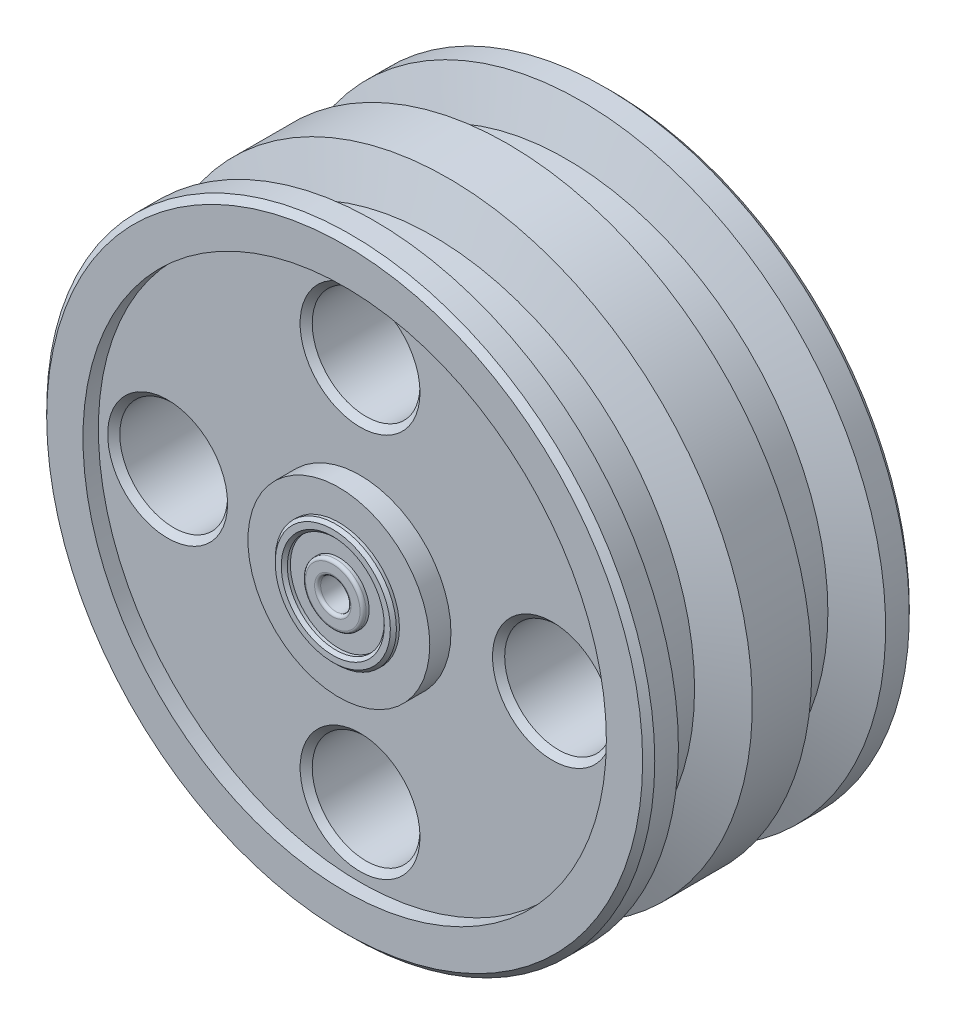
ISO-10303-21;
HEADER;
FILE_DESCRIPTION(('STEP AP214'),'2;1');
FILE_NAME('part.step','',(''),(''),'','','');
FILE_SCHEMA(('AUTOMOTIVE_DESIGN { 1 0 10303 214 1 1 1 1 }'));
ENDSEC;
DATA;
#1=APPLICATION_CONTEXT('core data for automotive mechanical design processes');
#2=APPLICATION_PROTOCOL_DEFINITION('international standard','automotive_design',2000,#1);
#3=PRODUCT_CONTEXT('',#1,'mechanical');
#4=PRODUCT('Part','Part','',(#3));
#5=PRODUCT_RELATED_PRODUCT_CATEGORY('part','',(#4));
#6=PRODUCT_DEFINITION_FORMATION('','',#4);
#7=PRODUCT_DEFINITION_CONTEXT('part definition',#1,'design');
#8=PRODUCT_DEFINITION('design','',#6,#7);
#9=PRODUCT_DEFINITION_SHAPE('','',#8);
#10=(LENGTH_UNIT() NAMED_UNIT(*) SI_UNIT(.MILLI.,.METRE.));
#11=(NAMED_UNIT(*) PLANE_ANGLE_UNIT() SI_UNIT($,.RADIAN.));
#12=(NAMED_UNIT(*) SI_UNIT($,.STERADIAN.) SOLID_ANGLE_UNIT());
#13=UNCERTAINTY_MEASURE_WITH_UNIT(LENGTH_MEASURE(1.E-05),#10,'distance_accuracy_value','');
#14=(GEOMETRIC_REPRESENTATION_CONTEXT(3) GLOBAL_UNCERTAINTY_ASSIGNED_CONTEXT((#13)) GLOBAL_UNIT_ASSIGNED_CONTEXT((#10,
#11,#12)) REPRESENTATION_CONTEXT('',''));
#15=CARTESIAN_POINT('',(0.,0.,0.));
#16=DIRECTION('',(0.,0.,1.));
#17=DIRECTION('',(1.,0.,0.));
#18=AXIS2_PLACEMENT_3D('',#15,#16,#17);
#19=CARTESIAN_POINT('',(0.,0.,-45.));
#20=DIRECTION('',(0.,0.,-1.));
#21=DIRECTION('',(-1.,0.,0.));
#22=AXIS2_PLACEMENT_3D('',#19,#20,#21);
#23=PLANE('',#22);
#24=CARTESIAN_POINT('',(0.,0.,-45.));
#25=DIRECTION('',(0.,0.,-1.));
#26=DIRECTION('',(-1.,0.,0.));
#27=AXIS2_PLACEMENT_3D('',#24,#25,#26);
#28=CIRCLE('',#27,15.);
#29=CARTESIAN_POINT('',(-15.,0.,-45.));
#30=VERTEX_POINT('',#29);
#31=EDGE_CURVE('E210',#30,#30,#28,.T.);
#32=ORIENTED_EDGE('',*,*,#31,.T.);
#33=EDGE_LOOP('',(#32));
#34=FACE_BOUND('',#33,.T.);
#35=CARTESIAN_POINT('',(0.,0.,-45.));
#36=DIRECTION('',(0.,0.,-1.));
#37=DIRECTION('',(-1.,0.,0.));
#38=AXIS2_PLACEMENT_3D('',#35,#36,#37);
#39=CIRCLE('',#38,10.);
#40=CARTESIAN_POINT('',(-10.,0.,-45.));
#41=VERTEX_POINT('',#40);
#42=EDGE_CURVE('E213',#41,#41,#39,.T.);
#43=ORIENTED_EDGE('',*,*,#42,.F.);
#44=EDGE_LOOP('',(#43));
#45=FACE_BOUND('',#44,.T.);
#46=ADVANCED_FACE('F40',(#34,#45),#23,.T.);
#47=CARTESIAN_POINT('',(0.,0.,0.96));
#48=DIRECTION('',(0.,0.,1.));
#49=DIRECTION('',(1.,0.,0.));
#50=AXIS2_PLACEMENT_3D('',#47,#48,#49);
#51=PLANE('',#50);
#52=CARTESIAN_POINT('',(0.,0.,0.96));
#53=DIRECTION('',(0.,0.,1.));
#54=DIRECTION('',(1.,0.,0.));
#55=AXIS2_PLACEMENT_3D('',#52,#53,#54);
#56=CIRCLE('',#55,15.);
#57=CARTESIAN_POINT('',(15.,0.,0.96));
#58=VERTEX_POINT('',#57);
#59=EDGE_CURVE('E184',#58,#58,#56,.T.);
#60=ORIENTED_EDGE('',*,*,#59,.T.);
#61=EDGE_LOOP('',(#60));
#62=FACE_BOUND('',#61,.T.);
#63=CARTESIAN_POINT('',(0.,0.,0.96));
#64=DIRECTION('',(0.,0.,1.));
#65=DIRECTION('',(1.,0.,0.));
#66=AXIS2_PLACEMENT_3D('',#63,#64,#65);
#67=CIRCLE('',#66,10.);
#68=CARTESIAN_POINT('',(10.,0.,0.96));
#69=VERTEX_POINT('',#68);
#70=EDGE_CURVE('E190',#69,#69,#67,.T.);
#71=ORIENTED_EDGE('',*,*,#70,.F.);
#72=EDGE_LOOP('',(#71));
#73=FACE_BOUND('',#72,.T.);
#74=ADVANCED_FACE('F244',(#62,#73),#51,.T.);
#75=CARTESIAN_POINT('',(0.,0.,-2.54));
#76=DIRECTION('',(0.,0.,1.));
#77=DIRECTION('',(1.,0.,0.));
#78=AXIS2_PLACEMENT_3D('',#75,#76,#77);
#79=PLANE('',#78);
#80=CARTESIAN_POINT('',(-1.79700204165607E-12,-31.75,-2.54));
#81=DIRECTION('',(0.,0.,1.));
#82=DIRECTION('',(1.,0.,0.));
#83=AXIS2_PLACEMENT_3D('',#80,#81,#82);
#84=CIRCLE('',#83,9.89000000000194);
#85=CARTESIAN_POINT('',(9.89000000000014,-31.75,-2.54));
#86=VERTEX_POINT('',#85);
#87=EDGE_CURVE('E60',#86,#86,#84,.F.);
#88=ORIENTED_EDGE('',*,*,#87,.T.);
#89=EDGE_LOOP('',(#88));
#90=FACE_BOUND('',#89,.T.);
#91=CARTESIAN_POINT('',(-31.7500000000009,8.98501020828034E-13,-2.54));
#92=DIRECTION('',(0.,0.,1.));
#93=DIRECTION('',(1.,0.,0.));
#94=AXIS2_PLACEMENT_3D('',#91,#92,#93);
#95=CIRCLE('',#94,9.89000000000072);
#96=CARTESIAN_POINT('',(-21.8600000000002,8.98501020828034E-13,-2.54));
#97=VERTEX_POINT('',#96);
#98=EDGE_CURVE('E63',#97,#97,#95,.F.);
#99=ORIENTED_EDGE('',*,*,#98,.T.);
#100=EDGE_LOOP('',(#99));
#101=FACE_BOUND('',#100,.T.);
#102=CARTESIAN_POINT('',(0.,31.75,-2.54));
#103=DIRECTION('',(0.,0.,1.));
#104=DIRECTION('',(1.,0.,0.));
#105=AXIS2_PLACEMENT_3D('',#102,#103,#104);
#106=CIRCLE('',#105,9.89000000000001);
#107=CARTESIAN_POINT('',(9.89000000000001,31.75,-2.54));
#108=VERTEX_POINT('',#107);
#109=EDGE_CURVE('E66',#108,#108,#106,.F.);
#110=ORIENTED_EDGE('',*,*,#109,.T.);
#111=EDGE_LOOP('',(#110));
#112=FACE_BOUND('',#111,.T.);
#113=CARTESIAN_POINT('',(31.7499999999991,-9.02389274415327E-13,-2.54));
#114=DIRECTION('',(0.,0.,1.));
#115=DIRECTION('',(1.,0.,0.));
#116=AXIS2_PLACEMENT_3D('',#113,#114,#115);
#117=CIRCLE('',#116,9.89000000000144);
#118=CARTESIAN_POINT('',(41.6400000000005,-9.02389274415327E-13,-2.54));
#119=VERTEX_POINT('',#118);
#120=EDGE_CURVE('E69',#119,#119,#117,.F.);
#121=ORIENTED_EDGE('',*,*,#120,.T.);
#122=EDGE_LOOP('',(#121));
#123=FACE_BOUND('',#122,.T.);
#124=CARTESIAN_POINT('',(0.,0.,-2.54));
#125=DIRECTION('',(0.,0.,1.));
#126=DIRECTION('',(1.,0.,0.));
#127=AXIS2_PLACEMENT_3D('',#124,#125,#126);
#128=CIRCLE('',#127,43.18);
#129=CARTESIAN_POINT('',(43.18,0.,-2.54));
#130=VERTEX_POINT('',#129);
#131=EDGE_CURVE('E180',#130,#130,#128,.T.);
#132=ORIENTED_EDGE('',*,*,#131,.T.);
#133=EDGE_LOOP('',(#132));
#134=FACE_BOUND('',#133,.T.);
#135=CARTESIAN_POINT('',(0.,0.,-2.54));
#136=DIRECTION('',(0.,0.,1.));
#137=DIRECTION('',(1.,0.,0.));
#138=AXIS2_PLACEMENT_3D('',#135,#136,#137);
#139=CIRCLE('',#138,15.);
#140=CARTESIAN_POINT('',(15.,0.,-2.54));
#141=VERTEX_POINT('',#140);
#142=EDGE_CURVE('E187',#141,#141,#139,.T.);
#143=ORIENTED_EDGE('',*,*,#142,.F.);
#144=EDGE_LOOP('',(#143));
#145=FACE_BOUND('',#144,.T.);
#146=ADVANCED_FACE('F250',(#90,#101,#112,#123,#134,#145),#79,.T.);
#147=CARTESIAN_POINT('',(0.,0.,-10.));
#148=DIRECTION('',(0.,0.,1.));
#149=DIRECTION('',(1.,0.,0.));
#150=AXIS2_PLACEMENT_3D('',#147,#148,#149);
#151=CYLINDRICAL_SURFACE('',#150,50.165);
#152=CARTESIAN_POINT('',(0.,0.,-1.));
#153=DIRECTION('',(0.,0.,1.));
#154=DIRECTION('',(1.,0.,0.));
#155=AXIS2_PLACEMENT_3D('',#152,#153,#154);
#156=CIRCLE('',#155,50.165);
#157=CARTESIAN_POINT('',(50.165,0.,-1.));
#158=VERTEX_POINT('',#157);
#159=EDGE_CURVE('E51',#158,#158,#156,.F.);
#160=ORIENTED_EDGE('',*,*,#159,.T.);
#161=EDGE_LOOP('',(#160));
#162=FACE_BOUND('',#161,.T.);
#163=CARTESIAN_POINT('',(0.,0.,-4.90441672027304));
#164=DIRECTION('',(0.,0.,1.));
#165=DIRECTION('',(1.,0.,0.));
#166=AXIS2_PLACEMENT_3D('',#163,#164,#165);
#167=CIRCLE('',#166,50.165);
#168=CARTESIAN_POINT('',(50.165,0.,-4.90441672027304));
#169=VERTEX_POINT('',#168);
#170=EDGE_CURVE('E177',#169,#169,#167,.T.);
#171=ORIENTED_EDGE('',*,*,#170,.T.);
#172=EDGE_LOOP('',(#171));
#173=FACE_BOUND('',#172,.T.);
#174=ADVANCED_FACE('F296',(#162,#173),#151,.T.);
#175=CARTESIAN_POINT('',(0.,0.,0.));
#176=DIRECTION('',(0.,0.,1.));
#177=DIRECTION('',(1.,0.,0.));
#178=AXIS2_PLACEMENT_3D('',#175,#176,#177);
#179=PLANE('',#178);
#180=CARTESIAN_POINT('',(0.,0.,0.));
#181=DIRECTION('',(0.,0.,1.));
#182=DIRECTION('',(1.,0.,0.));
#183=AXIS2_PLACEMENT_3D('',#180,#181,#182);
#184=CIRCLE('',#183,49.165);
#185=CARTESIAN_POINT('',(49.165,0.,0.));
#186=VERTEX_POINT('',#185);
#187=EDGE_CURVE('E55',#186,#186,#184,.T.);
#188=ORIENTED_EDGE('',*,*,#187,.T.);
#189=EDGE_LOOP('',(#188));
#190=FACE_BOUND('',#189,.T.);
#191=CARTESIAN_POINT('',(0.,0.,0.));
#192=DIRECTION('',(0.,0.,1.));
#193=DIRECTION('',(1.,0.,0.));
#194=AXIS2_PLACEMENT_3D('',#191,#192,#193);
#195=CIRCLE('',#194,43.18);
#196=CARTESIAN_POINT('',(43.18,0.,0.));
#197=VERTEX_POINT('',#196);
#198=EDGE_CURVE('E181',#197,#197,#195,.T.);
#199=ORIENTED_EDGE('',*,*,#198,.F.);
#200=EDGE_LOOP('',(#199));
#201=FACE_BOUND('',#200,.T.);
#202=ADVANCED_FACE('F320',(#190,#201),#179,.T.);
#203=CARTESIAN_POINT('',(0.,0.,-12.));
#204=DIRECTION('',(0.,0.,1.));
#205=DIRECTION('',(1.,0.,0.));
#206=AXIS2_PLACEMENT_3D('',#203,#204,#205);
#207=CYLINDRICAL_SURFACE('',#206,43.18);
#208=CARTESIAN_POINT('',(0.,0.,-14.5532511933775));
#209=DIRECTION('',(0.,0.,-1.));
#210=DIRECTION('',(-1.,0.,0.));
#211=AXIS2_PLACEMENT_3D('',#208,#209,#210);
#212=CIRCLE('',#211,43.18);
#213=CARTESIAN_POINT('',(-43.18,0.,-14.5532511933775));
#214=VERTEX_POINT('',#213);
#215=EDGE_CURVE('E168',#214,#214,#212,.F.);
#216=ORIENTED_EDGE('',*,*,#215,.T.);
#217=EDGE_LOOP('',(#216));
#218=FACE_BOUND('',#217,.T.);
#219=CARTESIAN_POINT('',(0.,0.,-7.44674880662253));
#220=DIRECTION('',(0.,0.,1.));
#221=DIRECTION('',(1.,0.,0.));
#222=AXIS2_PLACEMENT_3D('',#219,#220,#221);
#223=CIRCLE('',#222,43.18);
#224=CARTESIAN_POINT('',(43.18,0.,-7.44674880662253));
#225=VERTEX_POINT('',#224);
#226=EDGE_CURVE('E174',#225,#225,#223,.F.);
#227=ORIENTED_EDGE('',*,*,#226,.T.);
#228=EDGE_LOOP('',(#227));
#229=FACE_BOUND('',#228,.T.);
#230=ADVANCED_FACE('F316',(#218,#229),#207,.T.);
#231=CARTESIAN_POINT('',(0.,0.,-32.));
#232=DIRECTION('',(0.,0.,1.));
#233=DIRECTION('',(1.,0.,0.));
#234=AXIS2_PLACEMENT_3D('',#231,#232,#233);
#235=CYLINDRICAL_SURFACE('',#234,50.165);
#236=CARTESIAN_POINT('',(0.,0.,-26.904416720273));
#237=DIRECTION('',(0.,0.,-1.));
#238=DIRECTION('',(-1.,0.,0.));
#239=AXIS2_PLACEMENT_3D('',#236,#237,#238);
#240=CIRCLE('',#239,50.165);
#241=CARTESIAN_POINT('',(-50.165,0.,-26.904416720273));
#242=VERTEX_POINT('',#241);
#243=EDGE_CURVE('E165',#242,#242,#240,.F.);
#244=ORIENTED_EDGE('',*,*,#243,.T.);
#245=EDGE_LOOP('',(#244));
#246=FACE_BOUND('',#245,.T.);
#247=CARTESIAN_POINT('',(0.,0.,-17.095583279727));
#248=DIRECTION('',(0.,0.,-1.));
#249=DIRECTION('',(-1.,0.,0.));
#250=AXIS2_PLACEMENT_3D('',#247,#248,#249);
#251=CIRCLE('',#250,50.165);
#252=CARTESIAN_POINT('',(-50.165,0.,-17.095583279727));
#253=VERTEX_POINT('',#252);
#254=EDGE_CURVE('E171',#253,#253,#251,.T.);
#255=ORIENTED_EDGE('',*,*,#254,.T.);
#256=EDGE_LOOP('',(#255));
#257=FACE_BOUND('',#256,.T.);
#258=ADVANCED_FACE('F312',(#246,#257),#235,.T.);
#259=CARTESIAN_POINT('',(0.,0.,-34.));
#260=DIRECTION('',(0.,0.,1.));
#261=DIRECTION('',(1.,0.,0.));
#262=AXIS2_PLACEMENT_3D('',#259,#260,#261);
#263=CYLINDRICAL_SURFACE('',#262,43.18);
#264=CARTESIAN_POINT('',(0.,0.,-36.5532511933775));
#265=DIRECTION('',(0.,0.,-1.));
#266=DIRECTION('',(-1.,0.,0.));
#267=AXIS2_PLACEMENT_3D('',#264,#265,#266);
#268=CIRCLE('',#267,43.18);
#269=CARTESIAN_POINT('',(-43.18,0.,-36.5532511933775));
#270=VERTEX_POINT('',#269);
#271=EDGE_CURVE('E156',#270,#270,#268,.F.);
#272=ORIENTED_EDGE('',*,*,#271,.T.);
#273=EDGE_LOOP('',(#272));
#274=FACE_BOUND('',#273,.T.);
#275=CARTESIAN_POINT('',(0.,0.,-29.4467488066225));
#276=DIRECTION('',(0.,0.,1.));
#277=DIRECTION('',(1.,0.,0.));
#278=AXIS2_PLACEMENT_3D('',#275,#276,#277);
#279=CIRCLE('',#278,43.18);
#280=CARTESIAN_POINT('',(43.18,0.,-29.4467488066225));
#281=VERTEX_POINT('',#280);
#282=EDGE_CURVE('E162',#281,#281,#279,.F.);
#283=ORIENTED_EDGE('',*,*,#282,.T.);
#284=EDGE_LOOP('',(#283));
#285=FACE_BOUND('',#284,.T.);
#286=ADVANCED_FACE('F309',(#274,#285),#263,.T.);
#287=CARTESIAN_POINT('',(0.,0.,-44.));
#288=DIRECTION('',(0.,0.,1.));
#289=DIRECTION('',(1.,0.,0.));
#290=AXIS2_PLACEMENT_3D('',#287,#288,#289);
#291=CYLINDRICAL_SURFACE('',#290,50.165);
#292=CARTESIAN_POINT('',(0.,0.,-43.));
#293=DIRECTION('',(0.,0.,-1.));
#294=DIRECTION('',(-1.,0.,0.));
#295=AXIS2_PLACEMENT_3D('',#292,#293,#294);
#296=CIRCLE('',#295,50.165);
#297=CARTESIAN_POINT('',(-50.165,0.,-43.));
#298=VERTEX_POINT('',#297);
#299=EDGE_CURVE('E11',#298,#298,#296,.F.);
#300=ORIENTED_EDGE('',*,*,#299,.T.);
#301=EDGE_LOOP('',(#300));
#302=FACE_BOUND('',#301,.T.);
#303=CARTESIAN_POINT('',(0.,0.,-39.095583279727));
#304=DIRECTION('',(0.,0.,-1.));
#305=DIRECTION('',(-1.,0.,0.));
#306=AXIS2_PLACEMENT_3D('',#303,#304,#305);
#307=CIRCLE('',#306,50.165);
#308=CARTESIAN_POINT('',(-50.165,0.,-39.095583279727));
#309=VERTEX_POINT('',#308);
#310=EDGE_CURVE('E159',#309,#309,#307,.T.);
#311=ORIENTED_EDGE('',*,*,#310,.T.);
#312=EDGE_LOOP('',(#311));
#313=FACE_BOUND('',#312,.T.);
#314=ADVANCED_FACE('F306',(#302,#313),#291,.T.);
#315=CARTESIAN_POINT('',(0.,0.,-44.));
#316=DIRECTION('',(0.,0.,-1.));
#317=DIRECTION('',(-1.,0.,0.));
#318=AXIS2_PLACEMENT_3D('',#315,#316,#317);
#319=PLANE('',#318);
#320=CARTESIAN_POINT('',(0.,0.,-44.));
#321=DIRECTION('',(0.,0.,-1.));
#322=DIRECTION('',(-1.,0.,0.));
#323=AXIS2_PLACEMENT_3D('',#320,#321,#322);
#324=CIRCLE('',#323,49.165);
#325=CARTESIAN_POINT('',(-49.165,0.,-44.));
#326=VERTEX_POINT('',#325);
#327=EDGE_CURVE('E47',#326,#326,#324,.T.);
#328=ORIENTED_EDGE('',*,*,#327,.T.);
#329=EDGE_LOOP('',(#328));
#330=FACE_BOUND('',#329,.T.);
#331=CARTESIAN_POINT('',(0.,0.,-44.));
#332=DIRECTION('',(0.,0.,-1.));
#333=DIRECTION('',(-1.,0.,0.));
#334=AXIS2_PLACEMENT_3D('',#331,#332,#333);
#335=CIRCLE('',#334,43.18);
#336=CARTESIAN_POINT('',(-43.18,0.,-44.));
#337=VERTEX_POINT('',#336);
#338=EDGE_CURVE('E202',#337,#337,#335,.T.);
#339=ORIENTED_EDGE('',*,*,#338,.F.);
#340=EDGE_LOOP('',(#339));
#341=FACE_BOUND('',#340,.T.);
#342=ADVANCED_FACE('F302',(#330,#341),#319,.T.);
#343=CARTESIAN_POINT('',(0.,0.,-4.90441672027304));
#344=DIRECTION('',(0.,0.,1.));
#345=DIRECTION('',(1.,0.,0.));
#346=AXIS2_PLACEMENT_3D('',#343,#344,#345);
#347=CONICAL_SURFACE('',#346,50.165,1.22173047639602);
#348=ORIENTED_EDGE('',*,*,#226,.F.);
#349=EDGE_LOOP('',(#348));
#350=FACE_BOUND('',#349,.T.);
#351=ORIENTED_EDGE('',*,*,#170,.F.);
#352=EDGE_LOOP('',(#351));
#353=FACE_BOUND('',#352,.T.);
#354=ADVANCED_FACE('F305',(#350,#353),#347,.T.);
#355=CARTESIAN_POINT('',(0.,0.,-17.095583279727));
#356=DIRECTION('',(0.,0.,-1.));
#357=DIRECTION('',(-1.,0.,0.));
#358=AXIS2_PLACEMENT_3D('',#355,#356,#357);
#359=CONICAL_SURFACE('',#358,50.165,1.22173047639602);
#360=ORIENTED_EDGE('',*,*,#215,.F.);
#361=EDGE_LOOP('',(#360));
#362=FACE_BOUND('',#361,.T.);
#363=ORIENTED_EDGE('',*,*,#254,.F.);
#364=EDGE_LOOP('',(#363));
#365=FACE_BOUND('',#364,.T.);
#366=ADVANCED_FACE('F330',(#362,#365),#359,.T.);
#367=CARTESIAN_POINT('',(0.,0.,-32.));
#368=DIRECTION('',(0.,0.,1.));
#369=DIRECTION('',(1.,0.,0.));
#370=AXIS2_PLACEMENT_3D('',#367,#368,#369);
#371=CONICAL_SURFACE('',#370,36.165,1.22173047639602);
#372=ORIENTED_EDGE('',*,*,#243,.F.);
#373=EDGE_LOOP('',(#372));
#374=FACE_BOUND('',#373,.T.);
#375=ORIENTED_EDGE('',*,*,#282,.F.);
#376=EDGE_LOOP('',(#375));
#377=FACE_BOUND('',#376,.T.);
#378=ADVANCED_FACE('F334',(#374,#377),#371,.T.);
#379=CARTESIAN_POINT('',(0.,0.,-39.095583279727));
#380=DIRECTION('',(0.,0.,-1.));
#381=DIRECTION('',(-1.,0.,0.));
#382=AXIS2_PLACEMENT_3D('',#379,#380,#381);
#383=CONICAL_SURFACE('',#382,50.165,1.22173047639602);
#384=ORIENTED_EDGE('',*,*,#271,.F.);
#385=EDGE_LOOP('',(#384));
#386=FACE_BOUND('',#385,.T.);
#387=ORIENTED_EDGE('',*,*,#310,.F.);
#388=EDGE_LOOP('',(#387));
#389=FACE_BOUND('',#388,.T.);
#390=ADVANCED_FACE('F300',(#386,#389),#383,.T.);
#391=CARTESIAN_POINT('',(0.,0.,-2.54));
#392=DIRECTION('',(0.,0.,1.));
#393=DIRECTION('',(1.,0.,0.));
#394=AXIS2_PLACEMENT_3D('',#391,#392,#393);
#395=CYLINDRICAL_SURFACE('',#394,43.18);
#396=ORIENTED_EDGE('',*,*,#131,.F.);
#397=EDGE_LOOP('',(#396));
#398=FACE_BOUND('',#397,.T.);
#399=ORIENTED_EDGE('',*,*,#198,.T.);
#400=EDGE_LOOP('',(#399));
#401=FACE_BOUND('',#400,.T.);
#402=ADVANCED_FACE('F292',(#398,#401),#395,.F.);
#403=CARTESIAN_POINT('',(0.,0.,0.96));
#404=DIRECTION('',(0.,0.,-1.));
#405=DIRECTION('',(-1.,0.,0.));
#406=AXIS2_PLACEMENT_3D('',#403,#404,#405);
#407=CYLINDRICAL_SURFACE('',#406,15.);
#408=ORIENTED_EDGE('',*,*,#59,.F.);
#409=EDGE_LOOP('',(#408));
#410=FACE_BOUND('',#409,.T.);
#411=ORIENTED_EDGE('',*,*,#142,.T.);
#412=EDGE_LOOP('',(#411));
#413=FACE_BOUND('',#412,.T.);
#414=ADVANCED_FACE('F287',(#410,#413),#407,.T.);
#415=CARTESIAN_POINT('',(0.,0.,1.96));
#416=DIRECTION('',(0.,0.,-1.));
#417=DIRECTION('',(-1.,0.,0.));
#418=AXIS2_PLACEMENT_3D('',#415,#416,#417);
#419=CYLINDRICAL_SURFACE('',#418,10.);
#420=CARTESIAN_POINT('',(0.,0.,1.46));
#421=DIRECTION('',(0.,0.,1.));
#422=DIRECTION('',(1.,0.,0.));
#423=AXIS2_PLACEMENT_3D('',#420,#421,#422);
#424=CIRCLE('',#423,10.);
#425=CARTESIAN_POINT('',(10.,0.,1.46));
#426=VERTEX_POINT('',#425);
#427=EDGE_CURVE('E144',#426,#426,#424,.F.);
#428=ORIENTED_EDGE('',*,*,#427,.T.);
#429=EDGE_LOOP('',(#428));
#430=FACE_BOUND('',#429,.T.);
#431=ORIENTED_EDGE('',*,*,#70,.T.);
#432=EDGE_LOOP('',(#431));
#433=FACE_BOUND('',#432,.T.);
#434=ADVANCED_FACE('F284',(#430,#433),#419,.T.);
#435=CARTESIAN_POINT('',(0.,0.,1.96));
#436=DIRECTION('',(0.,0.,1.));
#437=DIRECTION('',(1.,0.,0.));
#438=AXIS2_PLACEMENT_3D('',#435,#436,#437);
#439=PLANE('',#438);
#440=CARTESIAN_POINT('',(0.,0.,1.96));
#441=DIRECTION('',(0.,0.,1.));
#442=DIRECTION('',(1.,0.,0.));
#443=AXIS2_PLACEMENT_3D('',#440,#441,#442);
#444=CIRCLE('',#443,8.50000000000002);
#445=CARTESIAN_POINT('',(8.50000000000002,0.,1.96));
#446=VERTEX_POINT('',#445);
#447=EDGE_CURVE('E147',#446,#446,#444,.F.);
#448=ORIENTED_EDGE('',*,*,#447,.T.);
#449=EDGE_LOOP('',(#448));
#450=FACE_BOUND('',#449,.T.);
#451=CARTESIAN_POINT('',(0.,0.,1.96));
#452=DIRECTION('',(0.,0.,1.));
#453=DIRECTION('',(1.,0.,0.));
#454=AXIS2_PLACEMENT_3D('',#451,#452,#453);
#455=CIRCLE('',#454,9.50000000000001);
#456=CARTESIAN_POINT('',(9.50000000000001,0.,1.96));
#457=VERTEX_POINT('',#456);
#458=EDGE_CURVE('E150',#457,#457,#455,.T.);
#459=ORIENTED_EDGE('',*,*,#458,.T.);
#460=EDGE_LOOP('',(#459));
#461=FACE_BOUND('',#460,.T.);
#462=ADVANCED_FACE('F280',(#450,#461),#439,.T.);
#463=CARTESIAN_POINT('',(0.,0.,0.96));
#464=DIRECTION('',(0.,0.,1.));
#465=DIRECTION('',(1.,0.,0.));
#466=AXIS2_PLACEMENT_3D('',#463,#464,#465);
#467=CYLINDRICAL_SURFACE('',#466,8.);
#468=CARTESIAN_POINT('',(0.,0.,1.45999999999998));
#469=DIRECTION('',(0.,0.,1.));
#470=DIRECTION('',(1.,0.,0.));
#471=AXIS2_PLACEMENT_3D('',#468,#469,#470);
#472=CIRCLE('',#471,8.);
#473=CARTESIAN_POINT('',(8.,0.,1.45999999999998));
#474=VERTEX_POINT('',#473);
#475=EDGE_CURVE('E153',#474,#474,#472,.T.);
#476=ORIENTED_EDGE('',*,*,#475,.T.);
#477=EDGE_LOOP('',(#476));
#478=FACE_BOUND('',#477,.T.);
#479=CARTESIAN_POINT('',(0.,0.,0.96));
#480=DIRECTION('',(0.,0.,1.));
#481=DIRECTION('',(1.,0.,0.));
#482=AXIS2_PLACEMENT_3D('',#479,#480,#481);
#483=CIRCLE('',#482,8.);
#484=CARTESIAN_POINT('',(8.,0.,0.96));
#485=VERTEX_POINT('',#484);
#486=EDGE_CURVE('E195',#485,#485,#483,.T.);
#487=ORIENTED_EDGE('',*,*,#486,.F.);
#488=EDGE_LOOP('',(#487));
#489=FACE_BOUND('',#488,.T.);
#490=ADVANCED_FACE('F276',(#478,#489),#467,.F.);
#491=CARTESIAN_POINT('',(0.,0.,0.96));
#492=DIRECTION('',(0.,0.,1.));
#493=DIRECTION('',(1.,0.,0.));
#494=AXIS2_PLACEMENT_3D('',#491,#492,#493);
#495=PLANE('',#494);
#496=CARTESIAN_POINT('',(0.,0.,0.96));
#497=DIRECTION('',(0.,0.,1.));
#498=DIRECTION('',(1.,0.,0.));
#499=AXIS2_PLACEMENT_3D('',#496,#497,#498);
#500=CIRCLE('',#499,5.);
#501=CARTESIAN_POINT('',(5.,0.,0.96));
#502=VERTEX_POINT('',#501);
#503=EDGE_CURVE('E198',#502,#502,#500,.T.);
#504=ORIENTED_EDGE('',*,*,#503,.F.);
#505=EDGE_LOOP('',(#504));
#506=FACE_BOUND('',#505,.T.);
#507=ORIENTED_EDGE('',*,*,#486,.T.);
#508=EDGE_LOOP('',(#507));
#509=FACE_BOUND('',#508,.T.);
#510=ADVANCED_FACE('F272',(#506,#509),#495,.T.);
#511=CARTESIAN_POINT('',(0.,0.,0.96));
#512=DIRECTION('',(0.,0.,1.));
#513=DIRECTION('',(1.,0.,0.));
#514=AXIS2_PLACEMENT_3D('',#511,#512,#513);
#515=CYLINDRICAL_SURFACE('',#514,5.);
#516=CARTESIAN_POINT('',(0.,0.,1.46));
#517=DIRECTION('',(0.,0.,1.));
#518=DIRECTION('',(1.,0.,0.));
#519=AXIS2_PLACEMENT_3D('',#516,#517,#518);
#520=CIRCLE('',#519,5.);
#521=CARTESIAN_POINT('',(5.,0.,1.46));
#522=VERTEX_POINT('',#521);
#523=EDGE_CURVE('E138',#522,#522,#520,.F.);
#524=ORIENTED_EDGE('',*,*,#523,.T.);
#525=EDGE_LOOP('',(#524));
#526=FACE_BOUND('',#525,.T.);
#527=ORIENTED_EDGE('',*,*,#503,.T.);
#528=EDGE_LOOP('',(#527));
#529=FACE_BOUND('',#528,.T.);
#530=ADVANCED_FACE('F269',(#526,#529),#515,.T.);
#531=CARTESIAN_POINT('',(0.,0.,1.96));
#532=DIRECTION('',(0.,0.,1.));
#533=DIRECTION('',(1.,0.,0.));
#534=AXIS2_PLACEMENT_3D('',#531,#532,#533);
#535=CIRCLE('',#534,3.);
#536=CARTESIAN_POINT('',(3.,0.,1.96));
#537=VERTEX_POINT('',#536);
#538=EDGE_CURVE('E132',#537,#537,#535,.F.);
#539=ORIENTED_EDGE('',*,*,#538,.T.);
#540=EDGE_LOOP('',(#539));
#541=FACE_BOUND('',#540,.T.);
#542=CARTESIAN_POINT('',(0.,0.,1.96));
#543=DIRECTION('',(0.,0.,1.));
#544=DIRECTION('',(1.,0.,0.));
#545=AXIS2_PLACEMENT_3D('',#542,#543,#544);
#546=CIRCLE('',#545,4.5);
#547=CARTESIAN_POINT('',(4.5,0.,1.96));
#548=VERTEX_POINT('',#547);
#549=EDGE_CURVE('E141',#548,#548,#546,.T.);
#550=ORIENTED_EDGE('',*,*,#549,.T.);
#551=EDGE_LOOP('',(#550));
#552=FACE_BOUND('',#551,.T.);
#553=ADVANCED_FACE('F267',(#541,#552),#439,.T.);
#554=CARTESIAN_POINT('',(0.,0.,-41.46));
#555=DIRECTION('',(0.,0.,-1.));
#556=DIRECTION('',(-1.,0.,0.));
#557=AXIS2_PLACEMENT_3D('',#554,#555,#556);
#558=CYLINDRICAL_SURFACE('',#557,43.18);
#559=CARTESIAN_POINT('',(0.,0.,-41.46));
#560=DIRECTION('',(0.,0.,-1.));
#561=DIRECTION('',(-1.,0.,0.));
#562=AXIS2_PLACEMENT_3D('',#559,#560,#561);
#563=CIRCLE('',#562,43.18);
#564=CARTESIAN_POINT('',(-43.18,0.,-41.46));
#565=VERTEX_POINT('',#564);
#566=EDGE_CURVE('E201',#565,#565,#563,.T.);
#567=ORIENTED_EDGE('',*,*,#566,.F.);
#568=EDGE_LOOP('',(#567));
#569=FACE_BOUND('',#568,.T.);
#570=ORIENTED_EDGE('',*,*,#338,.T.);
#571=EDGE_LOOP('',(#570));
#572=FACE_BOUND('',#571,.T.);
#573=ADVANCED_FACE('F263',(#569,#572),#558,.F.);
#574=CARTESIAN_POINT('',(0.,0.,-41.46));
#575=DIRECTION('',(0.,0.,-1.));
#576=DIRECTION('',(-1.,0.,0.));
#577=AXIS2_PLACEMENT_3D('',#574,#575,#576);
#578=PLANE('',#577);
#579=CARTESIAN_POINT('',(-31.7500000000009,8.98501020828034E-13,-41.46));
#580=DIRECTION('',(0.,0.,-1.));
#581=DIRECTION('',(-1.,0.,0.));
#582=AXIS2_PLACEMENT_3D('',#579,#580,#581);
#583=CIRCLE('',#582,9.89000000000072);
#584=CARTESIAN_POINT('',(-41.6400000000016,8.98501020828034E-13,-41.46));
#585=VERTEX_POINT('',#584);
#586=EDGE_CURVE('E90',#585,#585,#583,.F.);
#587=ORIENTED_EDGE('',*,*,#586,.T.);
#588=EDGE_LOOP('',(#587));
#589=FACE_BOUND('',#588,.T.);
#590=CARTESIAN_POINT('',(0.,31.75,-41.46));
#591=DIRECTION('',(0.,0.,-1.));
#592=DIRECTION('',(-1.,0.,0.));
#593=AXIS2_PLACEMENT_3D('',#590,#591,#592);
#594=CIRCLE('',#593,9.89000000000001);
#595=CARTESIAN_POINT('',(-9.89000000000001,31.75,-41.46));
#596=VERTEX_POINT('',#595);
#597=EDGE_CURVE('E93',#596,#596,#594,.F.);
#598=ORIENTED_EDGE('',*,*,#597,.T.);
#599=EDGE_LOOP('',(#598));
#600=FACE_BOUND('',#599,.T.);
#601=CARTESIAN_POINT('',(31.7499999999991,-9.02389274415327E-13,-41.46));
#602=DIRECTION('',(0.,0.,-1.));
#603=DIRECTION('',(-1.,0.,0.));
#604=AXIS2_PLACEMENT_3D('',#601,#602,#603);
#605=CIRCLE('',#604,9.89000000000145);
#606=CARTESIAN_POINT('',(21.8599999999977,-9.02389274415327E-13,-41.46));
#607=VERTEX_POINT('',#606);
#608=EDGE_CURVE('E96',#607,#607,#605,.F.);
#609=ORIENTED_EDGE('',*,*,#608,.T.);
#610=EDGE_LOOP('',(#609));
#611=FACE_BOUND('',#610,.T.);
#612=CARTESIAN_POINT('',(-1.79700204165607E-12,-31.75,-41.46));
#613=DIRECTION('',(0.,0.,-1.));
#614=DIRECTION('',(-1.,0.,0.));
#615=AXIS2_PLACEMENT_3D('',#612,#613,#614);
#616=CIRCLE('',#615,9.8900000000019);
#617=CARTESIAN_POINT('',(-9.89000000000369,-31.75,-41.46));
#618=VERTEX_POINT('',#617);
#619=EDGE_CURVE('E99',#618,#618,#616,.F.);
#620=ORIENTED_EDGE('',*,*,#619,.T.);
#621=EDGE_LOOP('',(#620));
#622=FACE_BOUND('',#621,.T.);
#623=CARTESIAN_POINT('',(0.,0.,-41.46));
#624=DIRECTION('',(0.,0.,-1.));
#625=DIRECTION('',(-1.,0.,0.));
#626=AXIS2_PLACEMENT_3D('',#623,#624,#625);
#627=CIRCLE('',#626,15.);
#628=CARTESIAN_POINT('',(-15.,0.,-41.46));
#629=VERTEX_POINT('',#628);
#630=EDGE_CURVE('E205',#629,#629,#627,.T.);
#631=ORIENTED_EDGE('',*,*,#630,.F.);
#632=EDGE_LOOP('',(#631));
#633=FACE_BOUND('',#632,.T.);
#634=ORIENTED_EDGE('',*,*,#566,.T.);
#635=EDGE_LOOP('',(#634));
#636=FACE_BOUND('',#635,.T.);
#637=ADVANCED_FACE('F259',(#589,#600,#611,#622,#633,#636),#578,.T.);
#638=CARTESIAN_POINT('',(0.,0.,-41.46));
#639=DIRECTION('',(0.,0.,-1.));
#640=DIRECTION('',(-1.,0.,0.));
#641=AXIS2_PLACEMENT_3D('',#638,#639,#640);
#642=CYLINDRICAL_SURFACE('',#641,15.);
#643=ORIENTED_EDGE('',*,*,#630,.T.);
#644=EDGE_LOOP('',(#643));
#645=FACE_BOUND('',#644,.T.);
#646=ORIENTED_EDGE('',*,*,#31,.F.);
#647=EDGE_LOOP('',(#646));
#648=FACE_BOUND('',#647,.T.);
#649=ADVANCED_FACE('F256',(#645,#648),#642,.T.);
#650=CARTESIAN_POINT('',(0.,0.,-46.));
#651=DIRECTION('',(0.,0.,1.));
#652=DIRECTION('',(1.,0.,0.));
#653=AXIS2_PLACEMENT_3D('',#650,#651,#652);
#654=CYLINDRICAL_SURFACE('',#653,10.);
#655=CARTESIAN_POINT('',(0.,0.,-45.5));
#656=DIRECTION('',(0.,0.,-1.));
#657=DIRECTION('',(-1.,0.,0.));
#658=AXIS2_PLACEMENT_3D('',#655,#656,#657);
#659=CIRCLE('',#658,10.);
#660=CARTESIAN_POINT('',(-10.,0.,-45.5));
#661=VERTEX_POINT('',#660);
#662=EDGE_CURVE('E123',#661,#661,#659,.F.);
#663=ORIENTED_EDGE('',*,*,#662,.T.);
#664=EDGE_LOOP('',(#663));
#665=FACE_BOUND('',#664,.T.);
#666=ORIENTED_EDGE('',*,*,#42,.T.);
#667=EDGE_LOOP('',(#666));
#668=FACE_BOUND('',#667,.T.);
#669=ADVANCED_FACE('F239',(#665,#668),#654,.T.);
#670=CARTESIAN_POINT('',(0.,0.,-46.));
#671=DIRECTION('',(0.,0.,-1.));
#672=DIRECTION('',(-1.,0.,0.));
#673=AXIS2_PLACEMENT_3D('',#670,#671,#672);
#674=PLANE('',#673);
#675=CARTESIAN_POINT('',(0.,0.,-46.));
#676=DIRECTION('',(0.,0.,-1.));
#677=DIRECTION('',(-1.,0.,0.));
#678=AXIS2_PLACEMENT_3D('',#675,#676,#677);
#679=CIRCLE('',#678,9.50000000000001);
#680=CARTESIAN_POINT('',(-9.50000000000001,0.,-46.));
#681=VERTEX_POINT('',#680);
#682=EDGE_CURVE('E126',#681,#681,#679,.T.);
#683=ORIENTED_EDGE('',*,*,#682,.T.);
#684=EDGE_LOOP('',(#683));
#685=FACE_BOUND('',#684,.T.);
#686=CARTESIAN_POINT('',(0.,0.,-46.));
#687=DIRECTION('',(0.,0.,-1.));
#688=DIRECTION('',(-1.,0.,0.));
#689=AXIS2_PLACEMENT_3D('',#686,#687,#688);
#690=CIRCLE('',#689,8.49999999999999);
#691=CARTESIAN_POINT('',(-8.49999999999999,0.,-46.));
#692=VERTEX_POINT('',#691);
#693=EDGE_CURVE('E129',#692,#692,#690,.F.);
#694=ORIENTED_EDGE('',*,*,#693,.T.);
#695=EDGE_LOOP('',(#694));
#696=FACE_BOUND('',#695,.T.);
#697=ADVANCED_FACE('F233',(#685,#696),#674,.T.);
#698=CARTESIAN_POINT('',(0.,0.,-45.));
#699=DIRECTION('',(0.,0.,-1.));
#700=DIRECTION('',(-1.,0.,0.));
#701=AXIS2_PLACEMENT_3D('',#698,#699,#700);
#702=CYLINDRICAL_SURFACE('',#701,8.);
#703=CARTESIAN_POINT('',(0.,0.,-45.5));
#704=DIRECTION('',(0.,0.,-1.));
#705=DIRECTION('',(-1.,0.,0.));
#706=AXIS2_PLACEMENT_3D('',#703,#704,#705);
#707=CIRCLE('',#706,8.);
#708=CARTESIAN_POINT('',(-8.,0.,-45.5));
#709=VERTEX_POINT('',#708);
#710=EDGE_CURVE('E120',#709,#709,#707,.T.);
#711=ORIENTED_EDGE('',*,*,#710,.T.);
#712=EDGE_LOOP('',(#711));
#713=FACE_BOUND('',#712,.T.);
#714=CARTESIAN_POINT('',(0.,0.,-45.));
#715=DIRECTION('',(0.,0.,-1.));
#716=DIRECTION('',(-1.,0.,0.));
#717=AXIS2_PLACEMENT_3D('',#714,#715,#716);
#718=CIRCLE('',#717,8.);
#719=CARTESIAN_POINT('',(-8.,0.,-45.));
#720=VERTEX_POINT('',#719);
#721=EDGE_CURVE('E216',#720,#720,#718,.T.);
#722=ORIENTED_EDGE('',*,*,#721,.F.);
#723=EDGE_LOOP('',(#722));
#724=FACE_BOUND('',#723,.T.);
#725=ADVANCED_FACE('F228',(#713,#724),#702,.F.);
#726=CARTESIAN_POINT('',(0.,0.,-45.));
#727=DIRECTION('',(0.,0.,-1.));
#728=DIRECTION('',(-1.,0.,0.));
#729=AXIS2_PLACEMENT_3D('',#726,#727,#728);
#730=PLANE('',#729);
#731=CARTESIAN_POINT('',(0.,0.,-45.));
#732=DIRECTION('',(0.,0.,-1.));
#733=DIRECTION('',(-1.,0.,0.));
#734=AXIS2_PLACEMENT_3D('',#731,#732,#733);
#735=CIRCLE('',#734,5.);
#736=CARTESIAN_POINT('',(-5.,0.,-45.));
#737=VERTEX_POINT('',#736);
#738=EDGE_CURVE('E219',#737,#737,#735,.T.);
#739=ORIENTED_EDGE('',*,*,#738,.F.);
#740=EDGE_LOOP('',(#739));
#741=FACE_BOUND('',#740,.T.);
#742=ORIENTED_EDGE('',*,*,#721,.T.);
#743=EDGE_LOOP('',(#742));
#744=FACE_BOUND('',#743,.T.);
#745=ADVANCED_FACE('F225',(#741,#744),#730,.T.);
#746=CARTESIAN_POINT('',(0.,0.,-45.));
#747=DIRECTION('',(0.,0.,-1.));
#748=DIRECTION('',(-1.,0.,0.));
#749=AXIS2_PLACEMENT_3D('',#746,#747,#748);
#750=CYLINDRICAL_SURFACE('',#749,5.);
#751=CARTESIAN_POINT('',(0.,0.,-45.5));
#752=DIRECTION('',(0.,0.,-1.));
#753=DIRECTION('',(-1.,0.,0.));
#754=AXIS2_PLACEMENT_3D('',#751,#752,#753);
#755=CIRCLE('',#754,5.);
#756=CARTESIAN_POINT('',(-5.,0.,-45.5));
#757=VERTEX_POINT('',#756);
#758=EDGE_CURVE('E114',#757,#757,#755,.F.);
#759=ORIENTED_EDGE('',*,*,#758,.T.);
#760=EDGE_LOOP('',(#759));
#761=FACE_BOUND('',#760,.T.);
#762=ORIENTED_EDGE('',*,*,#738,.T.);
#763=EDGE_LOOP('',(#762));
#764=FACE_BOUND('',#763,.T.);
#765=ADVANCED_FACE('F223',(#761,#764),#750,.T.);
#766=CARTESIAN_POINT('',(0.,0.,-46.));
#767=DIRECTION('',(0.,0.,-1.));
#768=DIRECTION('',(-1.,0.,0.));
#769=AXIS2_PLACEMENT_3D('',#766,#767,#768);
#770=CIRCLE('',#769,3.);
#771=CARTESIAN_POINT('',(-3.,0.,-46.));
#772=VERTEX_POINT('',#771);
#773=EDGE_CURVE('E111',#772,#772,#770,.F.);
#774=ORIENTED_EDGE('',*,*,#773,.T.);
#775=EDGE_LOOP('',(#774));
#776=FACE_BOUND('',#775,.T.);
#777=CARTESIAN_POINT('',(0.,0.,-46.));
#778=DIRECTION('',(0.,0.,-1.));
#779=DIRECTION('',(-1.,0.,0.));
#780=AXIS2_PLACEMENT_3D('',#777,#778,#779);
#781=CIRCLE('',#780,4.50000000000003);
#782=CARTESIAN_POINT('',(-4.50000000000003,0.,-46.));
#783=VERTEX_POINT('',#782);
#784=EDGE_CURVE('E117',#783,#783,#781,.T.);
#785=ORIENTED_EDGE('',*,*,#784,.T.);
#786=EDGE_LOOP('',(#785));
#787=FACE_BOUND('',#786,.T.);
#788=ADVANCED_FACE('F242',(#776,#787),#674,.T.);
#789=CARTESIAN_POINT('',(0.,0.,-46.));
#790=DIRECTION('',(0.,0.,1.));
#791=DIRECTION('',(1.,0.,0.));
#792=AXIS2_PLACEMENT_3D('',#789,#790,#791);
#793=CYLINDRICAL_SURFACE('',#792,2.5);
#794=CARTESIAN_POINT('',(0.,0.,-45.5));
#795=DIRECTION('',(0.,0.,-1.));
#796=DIRECTION('',(-1.,0.,0.));
#797=AXIS2_PLACEMENT_3D('',#794,#795,#796);
#798=CIRCLE('',#797,2.5);
#799=CARTESIAN_POINT('',(-2.5,0.,-45.5));
#800=VERTEX_POINT('',#799);
#801=EDGE_CURVE('E108',#800,#800,#798,.T.);
#802=ORIENTED_EDGE('',*,*,#801,.T.);
#803=EDGE_LOOP('',(#802));
#804=FACE_BOUND('',#803,.T.);
#805=CARTESIAN_POINT('',(0.,0.,1.46));
#806=DIRECTION('',(0.,0.,1.));
#807=DIRECTION('',(1.,0.,0.));
#808=AXIS2_PLACEMENT_3D('',#805,#806,#807);
#809=CIRCLE('',#808,2.5);
#810=CARTESIAN_POINT('',(2.5,0.,1.46));
#811=VERTEX_POINT('',#810);
#812=EDGE_CURVE('E135',#811,#811,#809,.T.);
#813=ORIENTED_EDGE('',*,*,#812,.T.);
#814=EDGE_LOOP('',(#813));
#815=FACE_BOUND('',#814,.T.);
#816=ADVANCED_FACE('F346',(#804,#815),#793,.F.);
#817=CARTESIAN_POINT('',(0.,0.,1.45999999999998));
#818=DIRECTION('',(0.,0.,1.));
#819=DIRECTION('',(1.,0.,0.));
#820=AXIS2_PLACEMENT_3D('',#817,#818,#819);
#821=CONICAL_SURFACE('',#820,8.,0.785398163397448);
#822=ORIENTED_EDGE('',*,*,#447,.F.);
#823=EDGE_LOOP('',(#822));
#824=FACE_BOUND('',#823,.T.);
#825=ORIENTED_EDGE('',*,*,#475,.F.);
#826=EDGE_LOOP('',(#825));
#827=FACE_BOUND('',#826,.T.);
#828=ADVANCED_FACE('F342',(#824,#827),#821,.F.);
#829=CARTESIAN_POINT('',(0.,0.,1.96));
#830=DIRECTION('',(0.,0.,-1.));
#831=DIRECTION('',(-1.,0.,0.));
#832=AXIS2_PLACEMENT_3D('',#829,#830,#831);
#833=CONICAL_SURFACE('',#832,9.50000000000001,0.785398163397441);
#834=ORIENTED_EDGE('',*,*,#427,.F.);
#835=EDGE_LOOP('',(#834));
#836=FACE_BOUND('',#835,.T.);
#837=ORIENTED_EDGE('',*,*,#458,.F.);
#838=EDGE_LOOP('',(#837));
#839=FACE_BOUND('',#838,.T.);
#840=ADVANCED_FACE('F345',(#836,#839),#833,.T.);
#841=CARTESIAN_POINT('',(0.,0.,1.46));
#842=DIRECTION('',(0.,0.,1.));
#843=DIRECTION('',(1.,0.,0.));
#844=AXIS2_PLACEMENT_3D('',#841,#842,#843);
#845=TOROIDAL_SURFACE('',#844,4.5,0.5);
#846=ORIENTED_EDGE('',*,*,#523,.F.);
#847=EDGE_LOOP('',(#846));
#848=FACE_BOUND('',#847,.T.);
#849=ORIENTED_EDGE('',*,*,#549,.F.);
#850=EDGE_LOOP('',(#849));
#851=FACE_BOUND('',#850,.T.);
#852=ADVANCED_FACE('F350',(#848,#851),#845,.T.);
#853=CARTESIAN_POINT('',(0.,0.,1.46));
#854=DIRECTION('',(0.,0.,1.));
#855=DIRECTION('',(1.,0.,0.));
#856=AXIS2_PLACEMENT_3D('',#853,#854,#855);
#857=TOROIDAL_SURFACE('',#856,3.,0.5);
#858=ORIENTED_EDGE('',*,*,#538,.F.);
#859=EDGE_LOOP('',(#858));
#860=FACE_BOUND('',#859,.T.);
#861=ORIENTED_EDGE('',*,*,#812,.F.);
#862=EDGE_LOOP('',(#861));
#863=FACE_BOUND('',#862,.T.);
#864=ADVANCED_FACE('F354',(#860,#863),#857,.T.);
#865=CARTESIAN_POINT('',(0.,0.,-46.));
#866=DIRECTION('',(0.,0.,1.));
#867=DIRECTION('',(1.,0.,0.));
#868=AXIS2_PLACEMENT_3D('',#865,#866,#867);
#869=CONICAL_SURFACE('',#868,9.50000000000001,0.78539816339744);
#870=ORIENTED_EDGE('',*,*,#662,.F.);
#871=EDGE_LOOP('',(#870));
#872=FACE_BOUND('',#871,.T.);
#873=ORIENTED_EDGE('',*,*,#682,.F.);
#874=EDGE_LOOP('',(#873));
#875=FACE_BOUND('',#874,.T.);
#876=ADVANCED_FACE('F358',(#872,#875),#869,.T.);
#877=CARTESIAN_POINT('',(0.,0.,-45.5));
#878=DIRECTION('',(0.,0.,-1.));
#879=DIRECTION('',(-1.,0.,0.));
#880=AXIS2_PLACEMENT_3D('',#877,#878,#879);
#881=CONICAL_SURFACE('',#880,8.,0.785398163397434);
#882=ORIENTED_EDGE('',*,*,#693,.F.);
#883=EDGE_LOOP('',(#882));
#884=FACE_BOUND('',#883,.T.);
#885=ORIENTED_EDGE('',*,*,#710,.F.);
#886=EDGE_LOOP('',(#885));
#887=FACE_BOUND('',#886,.T.);
#888=ADVANCED_FACE('F362',(#884,#887),#881,.F.);
#889=CARTESIAN_POINT('',(0.,0.,-46.));
#890=DIRECTION('',(0.,0.,1.));
#891=DIRECTION('',(1.,0.,0.));
#892=AXIS2_PLACEMENT_3D('',#889,#890,#891);
#893=CONICAL_SURFACE('',#892,4.50000000000003,0.785398163397444);
#894=ORIENTED_EDGE('',*,*,#758,.F.);
#895=EDGE_LOOP('',(#894));
#896=FACE_BOUND('',#895,.T.);
#897=ORIENTED_EDGE('',*,*,#784,.F.);
#898=EDGE_LOOP('',(#897));
#899=FACE_BOUND('',#898,.T.);
#900=ADVANCED_FACE('F366',(#896,#899),#893,.T.);
#901=CARTESIAN_POINT('',(0.,0.,-45.5));
#902=DIRECTION('',(0.,0.,-1.));
#903=DIRECTION('',(-1.,0.,0.));
#904=AXIS2_PLACEMENT_3D('',#901,#902,#903);
#905=TOROIDAL_SURFACE('',#904,3.,0.5);
#906=ORIENTED_EDGE('',*,*,#801,.F.);
#907=EDGE_LOOP('',(#906));
#908=FACE_BOUND('',#907,.T.);
#909=ORIENTED_EDGE('',*,*,#773,.F.);
#910=EDGE_LOOP('',(#909));
#911=FACE_BOUND('',#910,.T.);
#912=ADVANCED_FACE('F370',(#908,#911),#905,.T.);
#913=CARTESIAN_POINT('',(0.,31.75,1.96));
#914=DIRECTION('',(0.,0.,-1.));
#915=DIRECTION('',(-1.,0.,0.));
#916=AXIS2_PLACEMENT_3D('',#913,#914,#915);
#917=CYLINDRICAL_SURFACE('',#916,8.89);
#918=CARTESIAN_POINT('',(0.,31.75,-40.46));
#919=DIRECTION('',(0.,0.,-1.));
#920=DIRECTION('',(-1.,0.,0.));
#921=AXIS2_PLACEMENT_3D('',#918,#919,#920);
#922=CIRCLE('',#921,8.89);
#923=CARTESIAN_POINT('',(-8.89,31.75,-40.46));
#924=VERTEX_POINT('',#923);
#925=EDGE_CURVE('E84',#924,#924,#922,.T.);
#926=ORIENTED_EDGE('',*,*,#925,.T.);
#927=EDGE_LOOP('',(#926));
#928=FACE_BOUND('',#927,.T.);
#929=CARTESIAN_POINT('',(0.,31.75,-3.54000000000001));
#930=DIRECTION('',(0.,0.,1.));
#931=DIRECTION('',(1.,0.,0.));
#932=AXIS2_PLACEMENT_3D('',#929,#930,#931);
#933=CIRCLE('',#932,8.89);
#934=CARTESIAN_POINT('',(8.89,31.75,-3.54000000000001));
#935=VERTEX_POINT('',#934);
#936=EDGE_CURVE('E87',#935,#935,#933,.T.);
#937=ORIENTED_EDGE('',*,*,#936,.T.);
#938=EDGE_LOOP('',(#937));
#939=FACE_BOUND('',#938,.T.);
#940=ADVANCED_FACE('F374',(#928,#939),#917,.F.);
#941=CARTESIAN_POINT('',(-31.7500000000009,8.98501020828034E-13,1.96));
#942=DIRECTION('',(0.,0.,-1.));
#943=DIRECTION('',(-1.,0.,0.));
#944=AXIS2_PLACEMENT_3D('',#941,#942,#943);
#945=CYLINDRICAL_SURFACE('',#944,8.8900000000007);
#946=CARTESIAN_POINT('',(-31.7500000000009,8.98501020828034E-13,-40.46));
#947=DIRECTION('',(0.,0.,-1.));
#948=DIRECTION('',(-1.,0.,0.));
#949=AXIS2_PLACEMENT_3D('',#946,#947,#948);
#950=CIRCLE('',#949,8.8900000000007);
#951=CARTESIAN_POINT('',(-40.6400000000016,8.98501020828034E-13,-40.46));
#952=VERTEX_POINT('',#951);
#953=EDGE_CURVE('E102',#952,#952,#950,.T.);
#954=ORIENTED_EDGE('',*,*,#953,.T.);
#955=EDGE_LOOP('',(#954));
#956=FACE_BOUND('',#955,.T.);
#957=CARTESIAN_POINT('',(-31.7500000000009,8.98501020828034E-13,-3.54000000000002));
#958=DIRECTION('',(0.,0.,1.));
#959=DIRECTION('',(1.,0.,0.));
#960=AXIS2_PLACEMENT_3D('',#957,#958,#959);
#961=CIRCLE('',#960,8.8900000000007);
#962=CARTESIAN_POINT('',(-22.8600000000002,8.98501020828034E-13,-3.54000000000002));
#963=VERTEX_POINT('',#962);
#964=EDGE_CURVE('E105',#963,#963,#961,.T.);
#965=ORIENTED_EDGE('',*,*,#964,.T.);
#966=EDGE_LOOP('',(#965));
#967=FACE_BOUND('',#966,.T.);
#968=ADVANCED_FACE('F525',(#956,#967),#945,.F.);
#969=CARTESIAN_POINT('',(-1.79700204165607E-12,-31.75,1.96));
#970=DIRECTION('',(0.,0.,-1.));
#971=DIRECTION('',(-1.,0.,0.));
#972=AXIS2_PLACEMENT_3D('',#969,#970,#971);
#973=CYLINDRICAL_SURFACE('',#972,8.89000000000193);
#974=CARTESIAN_POINT('',(-1.79700204165607E-12,-31.75,-40.4600000000001));
#975=DIRECTION('',(0.,0.,-1.));
#976=DIRECTION('',(-1.,0.,0.));
#977=AXIS2_PLACEMENT_3D('',#974,#975,#976);
#978=CIRCLE('',#977,8.89000000000193);
#979=CARTESIAN_POINT('',(-8.89000000000373,-31.75,-40.4600000000001));
#980=VERTEX_POINT('',#979);
#981=EDGE_CURVE('E72',#980,#980,#978,.T.);
#982=ORIENTED_EDGE('',*,*,#981,.T.);
#983=EDGE_LOOP('',(#982));
#984=FACE_BOUND('',#983,.T.);
#985=CARTESIAN_POINT('',(-1.79700204165607E-12,-31.75,-3.54000000000001));
#986=DIRECTION('',(0.,0.,1.));
#987=DIRECTION('',(1.,0.,0.));
#988=AXIS2_PLACEMENT_3D('',#985,#986,#987);
#989=CIRCLE('',#988,8.89000000000193);
#990=CARTESIAN_POINT('',(8.89000000000013,-31.75,-3.54000000000001));
#991=VERTEX_POINT('',#990);
#992=EDGE_CURVE('E75',#991,#991,#989,.T.);
#993=ORIENTED_EDGE('',*,*,#992,.T.);
#994=EDGE_LOOP('',(#993));
#995=FACE_BOUND('',#994,.T.);
#996=ADVANCED_FACE('F515',(#984,#995),#973,.F.);
#997=CARTESIAN_POINT('',(31.7499999999991,-9.02389274415327E-13,1.96));
#998=DIRECTION('',(0.,0.,-1.));
#999=DIRECTION('',(-1.,0.,0.));
#1000=AXIS2_PLACEMENT_3D('',#997,#998,#999);
#1001=CYLINDRICAL_SURFACE('',#1000,8.89000000000144);
#1002=CARTESIAN_POINT('',(31.7499999999991,-9.02389274415327E-13,-40.46));
#1003=DIRECTION('',(0.,0.,-1.));
#1004=DIRECTION('',(-1.,0.,0.));
#1005=AXIS2_PLACEMENT_3D('',#1002,#1003,#1004);
#1006=CIRCLE('',#1005,8.89000000000144);
#1007=CARTESIAN_POINT('',(22.8599999999977,-9.02389274415327E-13,-40.46));
#1008=VERTEX_POINT('',#1007);
#1009=EDGE_CURVE('E78',#1008,#1008,#1006,.T.);
#1010=ORIENTED_EDGE('',*,*,#1009,.T.);
#1011=EDGE_LOOP('',(#1010));
#1012=FACE_BOUND('',#1011,.T.);
#1013=CARTESIAN_POINT('',(31.7499999999991,-9.02389274415327E-13,-3.54));
#1014=DIRECTION('',(0.,0.,1.));
#1015=DIRECTION('',(1.,0.,0.));
#1016=AXIS2_PLACEMENT_3D('',#1013,#1014,#1015);
#1017=CIRCLE('',#1016,8.89000000000144);
#1018=CARTESIAN_POINT('',(40.6400000000005,-9.02389274415327E-13,-3.54));
#1019=VERTEX_POINT('',#1018);
#1020=EDGE_CURVE('E81',#1019,#1019,#1017,.T.);
#1021=ORIENTED_EDGE('',*,*,#1020,.T.);
#1022=EDGE_LOOP('',(#1021));
#1023=FACE_BOUND('',#1022,.T.);
#1024=ADVANCED_FACE('F380',(#1012,#1023),#1001,.F.);
#1025=CARTESIAN_POINT('',(-31.7500000000009,8.98501020828034E-13,-40.46));
#1026=DIRECTION('',(0.,0.,-1.));
#1027=DIRECTION('',(-1.,0.,0.));
#1028=AXIS2_PLACEMENT_3D('',#1025,#1026,#1027);
#1029=CONICAL_SURFACE('',#1028,8.8900000000007,0.785398163397452);
#1030=ORIENTED_EDGE('',*,*,#586,.F.);
#1031=EDGE_LOOP('',(#1030));
#1032=FACE_BOUND('',#1031,.T.);
#1033=ORIENTED_EDGE('',*,*,#953,.F.);
#1034=EDGE_LOOP('',(#1033));
#1035=FACE_BOUND('',#1034,.T.);
#1036=ADVANCED_FACE('F376',(#1032,#1035),#1029,.F.);
#1037=CARTESIAN_POINT('',(0.,31.75,-40.46));
#1038=DIRECTION('',(0.,0.,-1.));
#1039=DIRECTION('',(-1.,0.,0.));
#1040=AXIS2_PLACEMENT_3D('',#1037,#1038,#1039);
#1041=CONICAL_SURFACE('',#1040,8.89,0.78539816339745);
#1042=ORIENTED_EDGE('',*,*,#597,.F.);
#1043=EDGE_LOOP('',(#1042));
#1044=FACE_BOUND('',#1043,.T.);
#1045=ORIENTED_EDGE('',*,*,#925,.F.);
#1046=EDGE_LOOP('',(#1045));
#1047=FACE_BOUND('',#1046,.T.);
#1048=ADVANCED_FACE('F379',(#1044,#1047),#1041,.F.);
#1049=CARTESIAN_POINT('',(31.7499999999991,-9.02389274415327E-13,-40.46));
#1050=DIRECTION('',(0.,0.,-1.));
#1051=DIRECTION('',(-1.,0.,0.));
#1052=AXIS2_PLACEMENT_3D('',#1049,#1050,#1051);
#1053=CONICAL_SURFACE('',#1052,8.89000000000144,0.785398163397458);
#1054=ORIENTED_EDGE('',*,*,#608,.F.);
#1055=EDGE_LOOP('',(#1054));
#1056=FACE_BOUND('',#1055,.T.);
#1057=ORIENTED_EDGE('',*,*,#1009,.F.);
#1058=EDGE_LOOP('',(#1057));
#1059=FACE_BOUND('',#1058,.T.);
#1060=ADVANCED_FACE('F384',(#1056,#1059),#1053,.F.);
#1061=CARTESIAN_POINT('',(-1.79700204165607E-12,-31.75,-40.4600000000001));
#1062=DIRECTION('',(0.,0.,-1.));
#1063=DIRECTION('',(-1.,0.,0.));
#1064=AXIS2_PLACEMENT_3D('',#1061,#1062,#1063);
#1065=CONICAL_SURFACE('',#1064,8.89000000000193,0.78539816339746);
#1066=ORIENTED_EDGE('',*,*,#619,.F.);
#1067=EDGE_LOOP('',(#1066));
#1068=FACE_BOUND('',#1067,.T.);
#1069=ORIENTED_EDGE('',*,*,#981,.F.);
#1070=EDGE_LOOP('',(#1069));
#1071=FACE_BOUND('',#1070,.T.);
#1072=ADVANCED_FACE('F388',(#1068,#1071),#1065,.F.);
#1073=CARTESIAN_POINT('',(-1.79700204165607E-12,-31.75,-3.54000000000001));
#1074=DIRECTION('',(0.,0.,1.));
#1075=DIRECTION('',(1.,0.,0.));
#1076=AXIS2_PLACEMENT_3D('',#1073,#1074,#1075);
#1077=CONICAL_SURFACE('',#1076,8.89000000000193,0.785398163397447);
#1078=ORIENTED_EDGE('',*,*,#87,.F.);
#1079=EDGE_LOOP('',(#1078));
#1080=FACE_BOUND('',#1079,.T.);
#1081=ORIENTED_EDGE('',*,*,#992,.F.);
#1082=EDGE_LOOP('',(#1081));
#1083=FACE_BOUND('',#1082,.T.);
#1084=ADVANCED_FACE('F392',(#1080,#1083),#1077,.F.);
#1085=CARTESIAN_POINT('',(-31.7500000000009,8.98501020828034E-13,-3.54000000000002));
#1086=DIRECTION('',(0.,0.,1.));
#1087=DIRECTION('',(1.,0.,0.));
#1088=AXIS2_PLACEMENT_3D('',#1085,#1086,#1087);
#1089=CONICAL_SURFACE('',#1088,8.8900000000007,0.785398163397447);
#1090=ORIENTED_EDGE('',*,*,#98,.F.);
#1091=EDGE_LOOP('',(#1090));
#1092=FACE_BOUND('',#1091,.T.);
#1093=ORIENTED_EDGE('',*,*,#964,.F.);
#1094=EDGE_LOOP('',(#1093));
#1095=FACE_BOUND('',#1094,.T.);
#1096=ADVANCED_FACE('F396',(#1092,#1095),#1089,.F.);
#1097=CARTESIAN_POINT('',(0.,31.75,-3.54000000000001));
#1098=DIRECTION('',(0.,0.,1.));
#1099=DIRECTION('',(1.,0.,0.));
#1100=AXIS2_PLACEMENT_3D('',#1097,#1098,#1099);
#1101=CONICAL_SURFACE('',#1100,8.89,0.785398163397447);
#1102=ORIENTED_EDGE('',*,*,#109,.F.);
#1103=EDGE_LOOP('',(#1102));
#1104=FACE_BOUND('',#1103,.T.);
#1105=ORIENTED_EDGE('',*,*,#936,.F.);
#1106=EDGE_LOOP('',(#1105));
#1107=FACE_BOUND('',#1106,.T.);
#1108=ADVANCED_FACE('F400',(#1104,#1107),#1101,.F.);
#1109=CARTESIAN_POINT('',(31.7499999999991,-9.02389274415327E-13,-3.54));
#1110=DIRECTION('',(0.,0.,1.));
#1111=DIRECTION('',(1.,0.,0.));
#1112=AXIS2_PLACEMENT_3D('',#1109,#1110,#1111);
#1113=CONICAL_SURFACE('',#1112,8.89000000000144,0.785398163397446);
#1114=ORIENTED_EDGE('',*,*,#120,.F.);
#1115=EDGE_LOOP('',(#1114));
#1116=FACE_BOUND('',#1115,.T.);
#1117=ORIENTED_EDGE('',*,*,#1020,.F.);
#1118=EDGE_LOOP('',(#1117));
#1119=FACE_BOUND('',#1118,.T.);
#1120=ADVANCED_FACE('F404',(#1116,#1119),#1113,.F.);
#1121=CARTESIAN_POINT('',(0.,0.,0.));
#1122=DIRECTION('',(0.,0.,-1.));
#1123=DIRECTION('',(-1.,0.,0.));
#1124=AXIS2_PLACEMENT_3D('',#1121,#1122,#1123);
#1125=CONICAL_SURFACE('',#1124,49.165,0.785398163397452);
#1126=ORIENTED_EDGE('',*,*,#159,.F.);
#1127=EDGE_LOOP('',(#1126));
#1128=FACE_BOUND('',#1127,.T.);
#1129=ORIENTED_EDGE('',*,*,#187,.F.);
#1130=EDGE_LOOP('',(#1129));
#1131=FACE_BOUND('',#1130,.T.);
#1132=ADVANCED_FACE('F407',(#1128,#1131),#1125,.T.);
#1133=CARTESIAN_POINT('',(0.,0.,-44.));
#1134=DIRECTION('',(0.,0.,1.));
#1135=DIRECTION('',(1.,0.,0.));
#1136=AXIS2_PLACEMENT_3D('',#1133,#1134,#1135);
#1137=CONICAL_SURFACE('',#1136,49.165,0.785398163397438);
#1138=ORIENTED_EDGE('',*,*,#299,.F.);
#1139=EDGE_LOOP('',(#1138));
#1140=FACE_BOUND('',#1139,.T.);
#1141=ORIENTED_EDGE('',*,*,#327,.F.);
#1142=EDGE_LOOP('',(#1141));
#1143=FACE_BOUND('',#1142,.T.);
#1144=ADVANCED_FACE('F42',(#1140,#1143),#1137,.T.);
#1145=CLOSED_SHELL('',(#46,#74,#146,#174,#202,#230,#258,#286,#314,#342,#354,#366,#378,#390,#402,
#414,#434,#462,#490,#510,#530,#553,#573,#637,#649,#669,#697,#725,#745,#765,#788,#816,#828,#840,
#852,#864,#876,#888,#900,#912,#940,#968,#996,#1024,#1036,#1048,#1060,#1072,#1084,#1096,#1108,
#1120,#1132,#1144));
#1146=MANIFOLD_SOLID_BREP('B2',#1145);
#1147=ADVANCED_BREP_SHAPE_REPRESENTATION('',(#18,#1146),#14);
#1148=SHAPE_DEFINITION_REPRESENTATION(#9,#1147);
ENDSEC;
END-ISO-10303-21;
